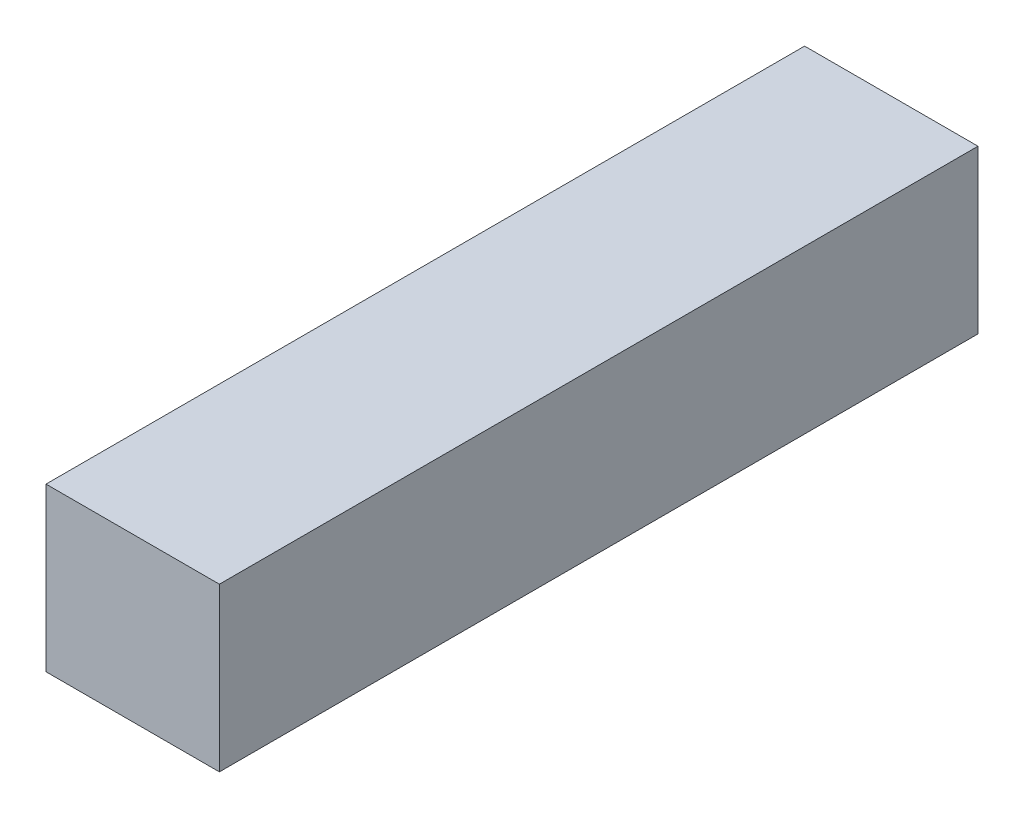
ISO-10303-21;
HEADER;
FILE_DESCRIPTION(('STEP AP214'),'2;1');
FILE_NAME('part.step','',(''),(''),'','','');
FILE_SCHEMA(('AUTOMOTIVE_DESIGN { 1 0 10303 214 1 1 1 1 }'));
ENDSEC;
DATA;
#1=APPLICATION_CONTEXT('core data for automotive mechanical design processes');
#2=APPLICATION_PROTOCOL_DEFINITION('international standard','automotive_design',2000,#1);
#3=PRODUCT_CONTEXT('',#1,'mechanical');
#4=PRODUCT('Part','Part','',(#3));
#5=PRODUCT_RELATED_PRODUCT_CATEGORY('part','',(#4));
#6=PRODUCT_DEFINITION_FORMATION('','',#4);
#7=PRODUCT_DEFINITION_CONTEXT('part definition',#1,'design');
#8=PRODUCT_DEFINITION('design','',#6,#7);
#9=PRODUCT_DEFINITION_SHAPE('','',#8);
#10=(LENGTH_UNIT() NAMED_UNIT(*) SI_UNIT(.MILLI.,.METRE.));
#11=(NAMED_UNIT(*) PLANE_ANGLE_UNIT() SI_UNIT($,.RADIAN.));
#12=(NAMED_UNIT(*) SI_UNIT($,.STERADIAN.) SOLID_ANGLE_UNIT());
#13=UNCERTAINTY_MEASURE_WITH_UNIT(LENGTH_MEASURE(1.E-05),#10,'distance_accuracy_value','');
#14=(GEOMETRIC_REPRESENTATION_CONTEXT(3) GLOBAL_UNCERTAINTY_ASSIGNED_CONTEXT((#13)) GLOBAL_UNIT_ASSIGNED_CONTEXT((#10,
#11,#12)) REPRESENTATION_CONTEXT('',''));
#15=CARTESIAN_POINT('',(0.,0.,0.));
#16=DIRECTION('',(0.,0.,1.));
#17=DIRECTION('',(1.,0.,0.));
#18=AXIS2_PLACEMENT_3D('',#15,#16,#17);
#19=CARTESIAN_POINT('',(32.,30.,280.));
#20=DIRECTION('',(-1.,0.,0.));
#21=DIRECTION('',(0.,-1.,0.));
#22=AXIS2_PLACEMENT_3D('',#19,#20,#21);
#23=PLANE('',#22);
#24=DIRECTION('',(0.,1.,0.));
#25=VECTOR('',#24,1.);
#26=CARTESIAN_POINT('',(32.,30.,0.));
#27=LINE('',#26,#25);
#28=CARTESIAN_POINT('',(32.,-30.,0.));
#29=VERTEX_POINT('',#28);
#30=CARTESIAN_POINT('',(32.,30.,0.));
#31=VERTEX_POINT('',#30);
#32=EDGE_CURVE('E104',#29,#31,#27,.T.);
#33=ORIENTED_EDGE('',*,*,#32,.T.);
#34=DIRECTION('',(0.,0.,-1.));
#35=VECTOR('',#34,1.);
#36=CARTESIAN_POINT('',(32.,30.,280.));
#37=LINE('',#36,#35);
#38=CARTESIAN_POINT('',(32.,30.,280.));
#39=VERTEX_POINT('',#38);
#40=EDGE_CURVE('E11',#39,#31,#37,.T.);
#41=ORIENTED_EDGE('',*,*,#40,.F.);
#42=DIRECTION('',(0.,1.,0.));
#43=VECTOR('',#42,1.);
#44=CARTESIAN_POINT('',(32.,30.,280.));
#45=LINE('',#44,#43);
#46=CARTESIAN_POINT('',(32.,-30.,280.));
#47=VERTEX_POINT('',#46);
#48=EDGE_CURVE('E92',#47,#39,#45,.T.);
#49=ORIENTED_EDGE('',*,*,#48,.F.);
#50=DIRECTION('',(0.,0.,-1.));
#51=VECTOR('',#50,1.);
#52=CARTESIAN_POINT('',(32.,-30.,280.));
#53=LINE('',#52,#51);
#54=EDGE_CURVE('E100',#47,#29,#53,.T.);
#55=ORIENTED_EDGE('',*,*,#54,.T.);
#56=EDGE_LOOP('',(#33,#41,#49,#55));
#57=FACE_BOUND('',#56,.T.);
#58=ADVANCED_FACE('F41',(#57),#23,.F.);
#59=CARTESIAN_POINT('',(-32.,30.,280.));
#60=DIRECTION('',(0.,-1.,0.));
#61=DIRECTION('',(0.,0.,-1.));
#62=AXIS2_PLACEMENT_3D('',#59,#60,#61);
#63=PLANE('',#62);
#64=DIRECTION('',(-1.,0.,0.));
#65=VECTOR('',#64,1.);
#66=CARTESIAN_POINT('',(-32.,30.,0.));
#67=LINE('',#66,#65);
#68=CARTESIAN_POINT('',(-32.,30.,0.));
#69=VERTEX_POINT('',#68);
#70=EDGE_CURVE('E96',#31,#69,#67,.T.);
#71=ORIENTED_EDGE('',*,*,#70,.T.);
#72=DIRECTION('',(0.,0.,-1.));
#73=VECTOR('',#72,1.);
#74=CARTESIAN_POINT('',(-32.,30.,280.));
#75=LINE('',#74,#73);
#76=CARTESIAN_POINT('',(-32.,30.,280.));
#77=VERTEX_POINT('',#76);
#78=EDGE_CURVE('E49',#77,#69,#75,.T.);
#79=ORIENTED_EDGE('',*,*,#78,.F.);
#80=DIRECTION('',(-1.,0.,0.));
#81=VECTOR('',#80,1.);
#82=CARTESIAN_POINT('',(-32.,30.,280.));
#83=LINE('',#82,#81);
#84=EDGE_CURVE('E87',#39,#77,#83,.T.);
#85=ORIENTED_EDGE('',*,*,#84,.F.);
#86=ORIENTED_EDGE('',*,*,#40,.T.);
#87=EDGE_LOOP('',(#71,#79,#85,#86));
#88=FACE_BOUND('',#87,.T.);
#89=ADVANCED_FACE('F95',(#88),#63,.F.);
#90=CARTESIAN_POINT('',(-32.,30.,280.));
#91=DIRECTION('',(1.,0.,0.));
#92=DIRECTION('',(0.,1.,0.));
#93=AXIS2_PLACEMENT_3D('',#90,#91,#92);
#94=PLANE('',#93);
#95=DIRECTION('',(0.,-1.,0.));
#96=VECTOR('',#95,1.);
#97=CARTESIAN_POINT('',(-32.,30.,0.));
#98=LINE('',#97,#96);
#99=CARTESIAN_POINT('',(-32.,-30.,0.));
#100=VERTEX_POINT('',#99);
#101=EDGE_CURVE('E74',#69,#100,#98,.T.);
#102=ORIENTED_EDGE('',*,*,#101,.T.);
#103=DIRECTION('',(0.,0.,-1.));
#104=VECTOR('',#103,1.);
#105=CARTESIAN_POINT('',(-32.,-30.,280.));
#106=LINE('',#105,#104);
#107=CARTESIAN_POINT('',(-32.,-30.,280.));
#108=VERTEX_POINT('',#107);
#109=EDGE_CURVE('E97',#108,#100,#106,.T.);
#110=ORIENTED_EDGE('',*,*,#109,.F.);
#111=DIRECTION('',(0.,-1.,0.));
#112=VECTOR('',#111,1.);
#113=CARTESIAN_POINT('',(-32.,30.,280.));
#114=LINE('',#113,#112);
#115=EDGE_CURVE('E90',#77,#108,#114,.T.);
#116=ORIENTED_EDGE('',*,*,#115,.F.);
#117=ORIENTED_EDGE('',*,*,#78,.T.);
#118=EDGE_LOOP('',(#102,#110,#116,#117));
#119=FACE_BOUND('',#118,.T.);
#120=ADVANCED_FACE('F98',(#119),#94,.F.);
#121=CARTESIAN_POINT('',(-32.,-30.,280.));
#122=DIRECTION('',(0.,1.,0.));
#123=DIRECTION('',(0.,0.,1.));
#124=AXIS2_PLACEMENT_3D('',#121,#122,#123);
#125=PLANE('',#124);
#126=DIRECTION('',(1.,0.,0.));
#127=VECTOR('',#126,1.);
#128=CARTESIAN_POINT('',(-32.,-30.,0.));
#129=LINE('',#128,#127);
#130=EDGE_CURVE('E80',#100,#29,#129,.T.);
#131=ORIENTED_EDGE('',*,*,#130,.T.);
#132=ORIENTED_EDGE('',*,*,#54,.F.);
#133=DIRECTION('',(1.,0.,0.));
#134=VECTOR('',#133,1.);
#135=CARTESIAN_POINT('',(-32.,-30.,280.));
#136=LINE('',#135,#134);
#137=EDGE_CURVE('E57',#108,#47,#136,.T.);
#138=ORIENTED_EDGE('',*,*,#137,.F.);
#139=ORIENTED_EDGE('',*,*,#109,.T.);
#140=EDGE_LOOP('',(#131,#132,#138,#139));
#141=FACE_BOUND('',#140,.T.);
#142=ADVANCED_FACE('F111',(#141),#125,.F.);
#143=CARTESIAN_POINT('',(0.,0.,280.));
#144=DIRECTION('',(0.,0.,1.));
#145=DIRECTION('',(1.,0.,0.));
#146=AXIS2_PLACEMENT_3D('',#143,#144,#145);
#147=PLANE('',#146);
#148=ORIENTED_EDGE('',*,*,#48,.T.);
#149=ORIENTED_EDGE('',*,*,#84,.T.);
#150=ORIENTED_EDGE('',*,*,#115,.T.);
#151=ORIENTED_EDGE('',*,*,#137,.T.);
#152=EDGE_LOOP('',(#148,#149,#150,#151));
#153=FACE_BOUND('',#152,.T.);
#154=ADVANCED_FACE('F88',(#153),#147,.T.);
#155=CARTESIAN_POINT('',(0.,0.,0.));
#156=DIRECTION('',(0.,0.,1.));
#157=DIRECTION('',(1.,0.,0.));
#158=AXIS2_PLACEMENT_3D('',#155,#156,#157);
#159=PLANE('',#158);
#160=ORIENTED_EDGE('',*,*,#32,.F.);
#161=ORIENTED_EDGE('',*,*,#130,.F.);
#162=ORIENTED_EDGE('',*,*,#101,.F.);
#163=ORIENTED_EDGE('',*,*,#70,.F.);
#164=EDGE_LOOP('',(#160,#161,#162,#163));
#165=FACE_BOUND('',#164,.T.);
#166=ADVANCED_FACE('F114',(#165),#159,.F.);
#167=CLOSED_SHELL('',(#58,#89,#120,#142,#154,#166));
#168=MANIFOLD_SOLID_BREP('B2',#167);
#169=ADVANCED_BREP_SHAPE_REPRESENTATION('',(#18,#168),#14);
#170=SHAPE_DEFINITION_REPRESENTATION(#9,#169);
ENDSEC;
END-ISO-10303-21;
